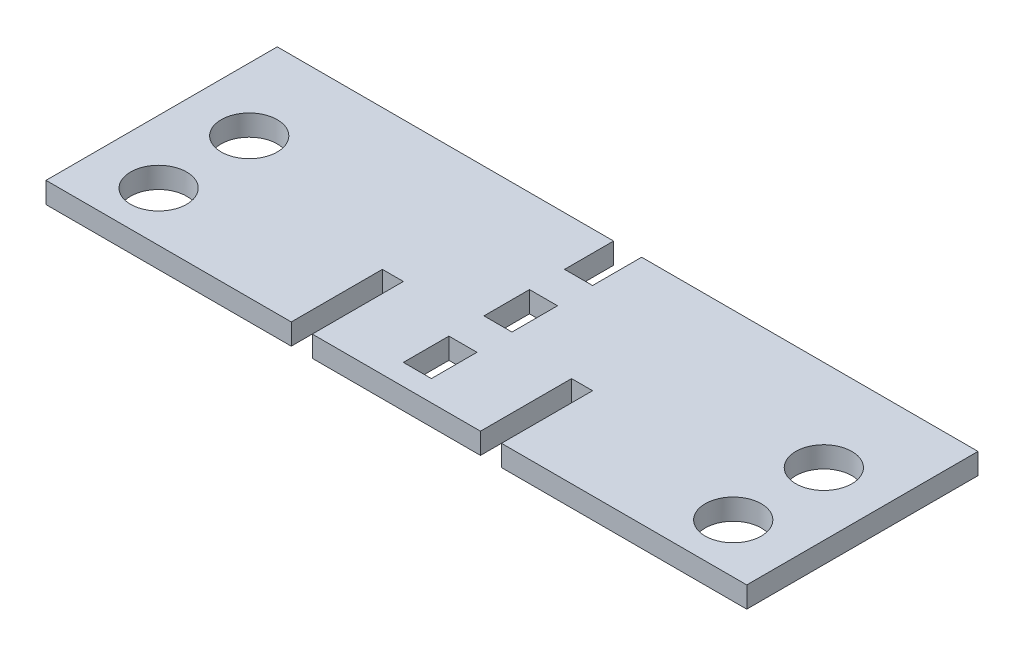
ISO-10303-21;
HEADER;
FILE_DESCRIPTION(('STEP AP214'),'2;1');
FILE_NAME('part.step','',(''),(''),'','','');
FILE_SCHEMA(('AUTOMOTIVE_DESIGN { 1 0 10303 214 1 1 1 1 }'));
ENDSEC;
DATA;
#1=APPLICATION_CONTEXT('core data for automotive mechanical design processes');
#2=APPLICATION_PROTOCOL_DEFINITION('international standard','automotive_design',2000,#1);
#3=PRODUCT_CONTEXT('',#1,'mechanical');
#4=PRODUCT('Part','Part','',(#3));
#5=PRODUCT_RELATED_PRODUCT_CATEGORY('part','',(#4));
#6=PRODUCT_DEFINITION_FORMATION('','',#4);
#7=PRODUCT_DEFINITION_CONTEXT('part definition',#1,'design');
#8=PRODUCT_DEFINITION('design','',#6,#7);
#9=PRODUCT_DEFINITION_SHAPE('','',#8);
#10=(LENGTH_UNIT() NAMED_UNIT(*) SI_UNIT(.MILLI.,.METRE.));
#11=(NAMED_UNIT(*) PLANE_ANGLE_UNIT() SI_UNIT($,.RADIAN.));
#12=(NAMED_UNIT(*) SI_UNIT($,.STERADIAN.) SOLID_ANGLE_UNIT());
#13=UNCERTAINTY_MEASURE_WITH_UNIT(LENGTH_MEASURE(1.E-05),#10,'distance_accuracy_value','');
#14=(GEOMETRIC_REPRESENTATION_CONTEXT(3) GLOBAL_UNCERTAINTY_ASSIGNED_CONTEXT((#13)) GLOBAL_UNIT_ASSIGNED_CONTEXT((#10,
#11,#12)) REPRESENTATION_CONTEXT('',''));
#15=CARTESIAN_POINT('',(0.,0.,0.));
#16=DIRECTION('',(0.,0.,1.));
#17=DIRECTION('',(1.,0.,0.));
#18=AXIS2_PLACEMENT_3D('',#15,#16,#17);
#19=CARTESIAN_POINT('',(-50.,3.,10.));
#20=DIRECTION('',(0.,0.,-1.));
#21=DIRECTION('',(-1.,0.,0.));
#22=AXIS2_PLACEMENT_3D('',#19,#20,#21);
#23=PLANE('',#22);
#24=DIRECTION('',(1.,0.,0.));
#25=VECTOR('',#24,1.);
#26=CARTESIAN_POINT('',(-50.,0.,10.));
#27=LINE('',#26,#25);
#28=CARTESIAN_POINT('',(12.,0.,10.));
#29=VERTEX_POINT('',#28);
#30=CARTESIAN_POINT('',(15.,0.,10.));
#31=VERTEX_POINT('',#30);
#32=EDGE_CURVE('E442',#29,#31,#27,.T.);
#33=ORIENTED_EDGE('',*,*,#32,.T.);
#34=DIRECTION('',(0.,1.,0.));
#35=VECTOR('',#34,1.);
#36=CARTESIAN_POINT('',(15.,-37.3363094051889,10.));
#37=LINE('',#36,#35);
#38=CARTESIAN_POINT('',(15.,3.,10.));
#39=VERTEX_POINT('',#38);
#40=EDGE_CURVE('E279',#31,#39,#37,.T.);
#41=ORIENTED_EDGE('',*,*,#40,.T.);
#42=DIRECTION('',(1.,0.,0.));
#43=VECTOR('',#42,1.);
#44=CARTESIAN_POINT('',(-50.,3.,10.));
#45=LINE('',#44,#43);
#46=CARTESIAN_POINT('',(12.,3.,10.));
#47=VERTEX_POINT('',#46);
#48=EDGE_CURVE('E419',#47,#39,#45,.T.);
#49=ORIENTED_EDGE('',*,*,#48,.F.);
#50=DIRECTION('',(0.,1.,0.));
#51=VECTOR('',#50,1.);
#52=CARTESIAN_POINT('',(12.,-27.2946881279124,10.));
#53=LINE('',#52,#51);
#54=EDGE_CURVE('E346',#29,#47,#53,.T.);
#55=ORIENTED_EDGE('',*,*,#54,.F.);
#56=EDGE_LOOP('',(#33,#41,#49,#55));
#57=FACE_BOUND('',#56,.T.);
#58=ADVANCED_FACE('F39',(#57),#23,.F.);
#59=CARTESIAN_POINT('',(0.,3.,0.));
#60=DIRECTION('',(0.,-1.,0.));
#61=DIRECTION('',(0.,0.,-1.));
#62=AXIS2_PLACEMENT_3D('',#59,#60,#61);
#63=PLANE('',#62);
#64=DIRECTION('',(1.,0.,0.));
#65=VECTOR('',#64,1.);
#66=CARTESIAN_POINT('',(-2.00000000000001,3.,8.50260308963582));
#67=LINE('',#66,#65);
#68=CARTESIAN_POINT('',(-2.00000000000001,3.,8.50260308963582));
#69=VERTEX_POINT('',#68);
#70=CARTESIAN_POINT('',(1.99999999999999,3.,8.50260308963582));
#71=VERTEX_POINT('',#70);
#72=EDGE_CURVE('E218',#69,#71,#67,.T.);
#73=ORIENTED_EDGE('',*,*,#72,.F.);
#74=DIRECTION('',(0.,0.,1.));
#75=VECTOR('',#74,1.);
#76=CARTESIAN_POINT('',(-2.00000000000001,3.,2.00260308963582));
#77=LINE('',#76,#75);
#78=CARTESIAN_POINT('',(-2.00000000000001,3.,2.00260308963582));
#79=VERTEX_POINT('',#78);
#80=EDGE_CURVE('E55',#79,#69,#77,.T.);
#81=ORIENTED_EDGE('',*,*,#80,.F.);
#82=DIRECTION('',(-1.,0.,0.));
#83=VECTOR('',#82,1.);
#84=CARTESIAN_POINT('',(-2.00000000000001,3.,2.00260308963582));
#85=LINE('',#84,#83);
#86=CARTESIAN_POINT('',(1.99999999999999,3.,2.00260308963582));
#87=VERTEX_POINT('',#86);
#88=EDGE_CURVE('E226',#87,#79,#85,.T.);
#89=ORIENTED_EDGE('',*,*,#88,.F.);
#90=DIRECTION('',(0.,0.,-1.));
#91=VECTOR('',#90,1.);
#92=CARTESIAN_POINT('',(1.99999999999999,3.,2.00260308963582));
#93=LINE('',#92,#91);
#94=EDGE_CURVE('E207',#71,#87,#93,.T.);
#95=ORIENTED_EDGE('',*,*,#94,.F.);
#96=EDGE_LOOP('',(#73,#81,#89,#95));
#97=FACE_BOUND('',#96,.T.);
#98=DIRECTION('',(1.,0.,0.));
#99=VECTOR('',#98,1.);
#100=CARTESIAN_POINT('',(-2.00000000000001,3.,20.0026030896358));
#101=LINE('',#100,#99);
#102=CARTESIAN_POINT('',(-2.00000000000001,3.,20.0026030896358));
#103=VERTEX_POINT('',#102);
#104=CARTESIAN_POINT('',(1.99999999999999,3.,20.0026030896358));
#105=VERTEX_POINT('',#104);
#106=EDGE_CURVE('E243',#103,#105,#101,.T.);
#107=ORIENTED_EDGE('',*,*,#106,.F.);
#108=DIRECTION('',(0.,0.,1.));
#109=VECTOR('',#108,1.);
#110=CARTESIAN_POINT('',(-2.00000000000001,3.,13.5026030896358));
#111=LINE('',#110,#109);
#112=CARTESIAN_POINT('',(-2.00000000000001,3.,13.5026030896358));
#113=VERTEX_POINT('',#112);
#114=EDGE_CURVE('E63',#113,#103,#111,.T.);
#115=ORIENTED_EDGE('',*,*,#114,.F.);
#116=DIRECTION('',(-1.,0.,0.));
#117=VECTOR('',#116,1.);
#118=CARTESIAN_POINT('',(-2.00000000000001,3.,13.5026030896358));
#119=LINE('',#118,#117);
#120=CARTESIAN_POINT('',(1.99999999999999,3.,13.5026030896358));
#121=VERTEX_POINT('',#120);
#122=EDGE_CURVE('E251',#121,#113,#119,.T.);
#123=ORIENTED_EDGE('',*,*,#122,.F.);
#124=DIRECTION('',(0.,0.,-1.));
#125=VECTOR('',#124,1.);
#126=CARTESIAN_POINT('',(1.99999999999999,3.,13.5026030896358));
#127=LINE('',#126,#125);
#128=EDGE_CURVE('E247',#105,#121,#127,.T.);
#129=ORIENTED_EDGE('',*,*,#128,.F.);
#130=EDGE_LOOP('',(#107,#115,#123,#129));
#131=FACE_BOUND('',#130,.T.);
#132=CARTESIAN_POINT('',(-41.,3.,15.9275305196327));
#133=DIRECTION('',(0.,1.,0.));
#134=DIRECTION('',(0.,0.,1.));
#135=AXIS2_PLACEMENT_3D('',#132,#133,#134);
#136=CIRCLE('',#135,4.00000000000001);
#137=CARTESIAN_POINT('',(-41.,3.,19.9275305196327));
#138=VERTEX_POINT('',#137);
#139=EDGE_CURVE('E267',#138,#138,#136,.T.);
#140=ORIENTED_EDGE('',*,*,#139,.F.);
#141=EDGE_LOOP('',(#140));
#142=FACE_BOUND('',#141,.T.);
#143=CARTESIAN_POINT('',(41.,3.,15.9275305196327));
#144=DIRECTION('',(0.,1.,0.));
#145=DIRECTION('',(0.,0.,1.));
#146=AXIS2_PLACEMENT_3D('',#143,#144,#145);
#147=CIRCLE('',#146,4.00000000000001);
#148=CARTESIAN_POINT('',(41.,3.,19.9275305196327));
#149=VERTEX_POINT('',#148);
#150=EDGE_CURVE('E236',#149,#149,#147,.T.);
#151=ORIENTED_EDGE('',*,*,#150,.F.);
#152=EDGE_LOOP('',(#151));
#153=FACE_BOUND('',#152,.T.);
#154=DIRECTION('',(0.,0.,1.));
#155=VECTOR('',#154,1.);
#156=CARTESIAN_POINT('',(1.99999999999999,3.,-10.));
#157=LINE('',#156,#155);
#158=CARTESIAN_POINT('',(1.99999999999999,3.,-10.));
#159=VERTEX_POINT('',#158);
#160=CARTESIAN_POINT('',(1.99999999999999,3.,-2.99739691036418));
#161=VERTEX_POINT('',#160);
#162=EDGE_CURVE('E407',#159,#161,#157,.T.);
#163=ORIENTED_EDGE('',*,*,#162,.T.);
#164=DIRECTION('',(1.,0.,0.));
#165=VECTOR('',#164,1.);
#166=CARTESIAN_POINT('',(-2.00000000000001,3.,-2.99739691036418));
#167=LINE('',#166,#165);
#168=CARTESIAN_POINT('',(-2.00000000000001,3.,-2.99739691036418));
#169=VERTEX_POINT('',#168);
#170=EDGE_CURVE('E378',#169,#161,#167,.T.);
#171=ORIENTED_EDGE('',*,*,#170,.F.);
#172=DIRECTION('',(0.,0.,-1.));
#173=VECTOR('',#172,1.);
#174=CARTESIAN_POINT('',(-2.00000000000001,3.,-10.));
#175=LINE('',#174,#173);
#176=CARTESIAN_POINT('',(-2.00000000000001,3.,-10.));
#177=VERTEX_POINT('',#176);
#178=EDGE_CURVE('E410',#169,#177,#175,.T.);
#179=ORIENTED_EDGE('',*,*,#178,.T.);
#180=DIRECTION('',(-1.,0.,0.));
#181=VECTOR('',#180,1.);
#182=CARTESIAN_POINT('',(-50.,3.,-10.));
#183=LINE('',#182,#181);
#184=CARTESIAN_POINT('',(-50.,3.,-10.));
#185=VERTEX_POINT('',#184);
#186=EDGE_CURVE('E413',#177,#185,#183,.T.);
#187=ORIENTED_EDGE('',*,*,#186,.T.);
#188=DIRECTION('',(0.,0.,1.));
#189=VECTOR('',#188,1.);
#190=CARTESIAN_POINT('',(-50.,3.,10.));
#191=LINE('',#190,#189);
#192=CARTESIAN_POINT('',(-50.,3.,23.));
#193=VERTEX_POINT('',#192);
#194=EDGE_CURVE('E416',#185,#193,#191,.T.);
#195=ORIENTED_EDGE('',*,*,#194,.T.);
#196=DIRECTION('',(1.,0.,0.));
#197=VECTOR('',#196,1.);
#198=CARTESIAN_POINT('',(-50.,3.,23.));
#199=LINE('',#198,#197);
#200=CARTESIAN_POINT('',(-15.,3.,23.));
#201=VERTEX_POINT('',#200);
#202=EDGE_CURVE('E298',#193,#201,#199,.T.);
#203=ORIENTED_EDGE('',*,*,#202,.T.);
#204=DIRECTION('',(0.,0.,-1.));
#205=VECTOR('',#204,1.);
#206=CARTESIAN_POINT('',(-15.,3.,10.));
#207=LINE('',#206,#205);
#208=CARTESIAN_POINT('',(-15.,3.,10.));
#209=VERTEX_POINT('',#208);
#210=EDGE_CURVE('E304',#201,#209,#207,.T.);
#211=ORIENTED_EDGE('',*,*,#210,.T.);
#212=CARTESIAN_POINT('',(-12.,3.,10.));
#213=VERTEX_POINT('',#212);
#214=EDGE_CURVE('E420',#209,#213,#45,.T.);
#215=ORIENTED_EDGE('',*,*,#214,.T.);
#216=DIRECTION('',(0.,0.,1.));
#217=VECTOR('',#216,1.);
#218=CARTESIAN_POINT('',(-12.,3.,23.));
#219=LINE('',#218,#217);
#220=CARTESIAN_POINT('',(-12.,3.,23.));
#221=VERTEX_POINT('',#220);
#222=EDGE_CURVE('E336',#213,#221,#219,.T.);
#223=ORIENTED_EDGE('',*,*,#222,.T.);
#224=DIRECTION('',(1.,0.,0.));
#225=VECTOR('',#224,1.);
#226=CARTESIAN_POINT('',(-12.,3.,23.));
#227=LINE('',#226,#225);
#228=CARTESIAN_POINT('',(12.,3.,23.));
#229=VERTEX_POINT('',#228);
#230=EDGE_CURVE('E331',#221,#229,#227,.T.);
#231=ORIENTED_EDGE('',*,*,#230,.T.);
#232=DIRECTION('',(0.,0.,-1.));
#233=VECTOR('',#232,1.);
#234=CARTESIAN_POINT('',(12.,3.,23.));
#235=LINE('',#234,#233);
#236=EDGE_CURVE('E330',#229,#47,#235,.T.);
#237=ORIENTED_EDGE('',*,*,#236,.T.);
#238=ORIENTED_EDGE('',*,*,#48,.T.);
#239=DIRECTION('',(0.,0.,1.));
#240=VECTOR('',#239,1.);
#241=CARTESIAN_POINT('',(15.,3.,10.));
#242=LINE('',#241,#240);
#243=CARTESIAN_POINT('',(15.,3.,23.));
#244=VERTEX_POINT('',#243);
#245=EDGE_CURVE('E280',#39,#244,#242,.T.);
#246=ORIENTED_EDGE('',*,*,#245,.T.);
#247=DIRECTION('',(1.,0.,0.));
#248=VECTOR('',#247,1.);
#249=CARTESIAN_POINT('',(50.,3.,23.));
#250=LINE('',#249,#248);
#251=CARTESIAN_POINT('',(50.,3.,23.));
#252=VERTEX_POINT('',#251);
#253=EDGE_CURVE('E275',#244,#252,#250,.T.);
#254=ORIENTED_EDGE('',*,*,#253,.T.);
#255=DIRECTION('',(0.,0.,-1.));
#256=VECTOR('',#255,1.);
#257=CARTESIAN_POINT('',(50.,3.,10.));
#258=LINE('',#257,#256);
#259=CARTESIAN_POINT('',(50.,3.,-10.));
#260=VERTEX_POINT('',#259);
#261=EDGE_CURVE('E399',#252,#260,#258,.T.);
#262=ORIENTED_EDGE('',*,*,#261,.T.);
#263=DIRECTION('',(-1.,0.,0.));
#264=VECTOR('',#263,1.);
#265=CARTESIAN_POINT('',(1.99999999999999,3.,-10.));
#266=LINE('',#265,#264);
#267=EDGE_CURVE('E403',#260,#159,#266,.T.);
#268=ORIENTED_EDGE('',*,*,#267,.T.);
#269=EDGE_LOOP('',(#163,#171,#179,#187,#195,#203,#211,#215,#223,#231,#237,#238,#246,#254,#262,#268));
#270=FACE_BOUND('',#269,.T.);
#271=CARTESIAN_POINT('',(-41.,3.,3.));
#272=DIRECTION('',(0.,1.,0.));
#273=DIRECTION('',(0.,0.,1.));
#274=AXIS2_PLACEMENT_3D('',#271,#272,#273);
#275=CIRCLE('',#274,4.00000000000001);
#276=CARTESIAN_POINT('',(-41.,3.,7.00000000000001));
#277=VERTEX_POINT('',#276);
#278=EDGE_CURVE('E391',#277,#277,#275,.T.);
#279=ORIENTED_EDGE('',*,*,#278,.F.);
#280=EDGE_LOOP('',(#279));
#281=FACE_BOUND('',#280,.T.);
#282=CARTESIAN_POINT('',(41.,3.,3.));
#283=DIRECTION('',(0.,1.,0.));
#284=DIRECTION('',(0.,0.,-1.));
#285=AXIS2_PLACEMENT_3D('',#282,#283,#284);
#286=CIRCLE('',#285,4.00000000000001);
#287=CARTESIAN_POINT('',(41.,3.,-1.));
#288=VERTEX_POINT('',#287);
#289=EDGE_CURVE('E383',#288,#288,#286,.T.);
#290=ORIENTED_EDGE('',*,*,#289,.F.);
#291=EDGE_LOOP('',(#290));
#292=FACE_BOUND('',#291,.T.);
#293=ADVANCED_FACE('F223',(#97,#131,#142,#153,#270,#281,#292),#63,.F.);
#294=CARTESIAN_POINT('',(0.,0.,0.));
#295=DIRECTION('',(0.,-1.,0.));
#296=DIRECTION('',(0.,0.,-1.));
#297=AXIS2_PLACEMENT_3D('',#294,#295,#296);
#298=PLANE('',#297);
#299=DIRECTION('',(0.,0.,-1.));
#300=VECTOR('',#299,1.);
#301=CARTESIAN_POINT('',(-2.00000000000001,0.,0.));
#302=LINE('',#301,#300);
#303=CARTESIAN_POINT('',(-2.00000000000001,0.,8.50260308963582));
#304=VERTEX_POINT('',#303);
#305=CARTESIAN_POINT('',(-2.00000000000001,0.,2.00260308963582));
#306=VERTEX_POINT('',#305);
#307=EDGE_CURVE('E11',#304,#306,#302,.T.);
#308=ORIENTED_EDGE('',*,*,#307,.F.);
#309=DIRECTION('',(-1.,0.,0.));
#310=VECTOR('',#309,1.);
#311=CARTESIAN_POINT('',(0.,0.,8.50260308963582));
#312=LINE('',#311,#310);
#313=CARTESIAN_POINT('',(1.99999999999999,0.,8.50260308963582));
#314=VERTEX_POINT('',#313);
#315=EDGE_CURVE('E479',#314,#304,#312,.T.);
#316=ORIENTED_EDGE('',*,*,#315,.F.);
#317=DIRECTION('',(0.,0.,1.));
#318=VECTOR('',#317,1.);
#319=CARTESIAN_POINT('',(1.99999999999999,0.,0.));
#320=LINE('',#319,#318);
#321=CARTESIAN_POINT('',(1.99999999999999,0.,2.00260308963582));
#322=VERTEX_POINT('',#321);
#323=EDGE_CURVE('E210',#322,#314,#320,.T.);
#324=ORIENTED_EDGE('',*,*,#323,.F.);
#325=DIRECTION('',(1.,0.,0.));
#326=VECTOR('',#325,1.);
#327=CARTESIAN_POINT('',(0.,0.,2.00260308963582));
#328=LINE('',#327,#326);
#329=EDGE_CURVE('E48',#306,#322,#328,.T.);
#330=ORIENTED_EDGE('',*,*,#329,.F.);
#331=EDGE_LOOP('',(#308,#316,#324,#330));
#332=FACE_BOUND('',#331,.T.);
#333=DIRECTION('',(0.,0.,-1.));
#334=VECTOR('',#333,1.);
#335=CARTESIAN_POINT('',(-2.00000000000001,0.,0.));
#336=LINE('',#335,#334);
#337=CARTESIAN_POINT('',(-2.00000000000001,0.,20.0026030896358));
#338=VERTEX_POINT('',#337);
#339=CARTESIAN_POINT('',(-2.00000000000001,0.,13.5026030896358));
#340=VERTEX_POINT('',#339);
#341=EDGE_CURVE('E476',#338,#340,#336,.T.);
#342=ORIENTED_EDGE('',*,*,#341,.F.);
#343=DIRECTION('',(-1.,0.,0.));
#344=VECTOR('',#343,1.);
#345=CARTESIAN_POINT('',(0.,0.,20.0026030896358));
#346=LINE('',#345,#344);
#347=CARTESIAN_POINT('',(1.99999999999999,0.,20.0026030896358));
#348=VERTEX_POINT('',#347);
#349=EDGE_CURVE('E460',#348,#338,#346,.T.);
#350=ORIENTED_EDGE('',*,*,#349,.F.);
#351=DIRECTION('',(0.,0.,1.));
#352=VECTOR('',#351,1.);
#353=CARTESIAN_POINT('',(1.99999999999999,0.,0.));
#354=LINE('',#353,#352);
#355=CARTESIAN_POINT('',(1.99999999999999,0.,13.5026030896358));
#356=VERTEX_POINT('',#355);
#357=EDGE_CURVE('E469',#356,#348,#354,.T.);
#358=ORIENTED_EDGE('',*,*,#357,.F.);
#359=DIRECTION('',(1.,0.,0.));
#360=VECTOR('',#359,1.);
#361=CARTESIAN_POINT('',(0.,0.,13.5026030896358));
#362=LINE('',#361,#360);
#363=EDGE_CURVE('E473',#340,#356,#362,.T.);
#364=ORIENTED_EDGE('',*,*,#363,.F.);
#365=EDGE_LOOP('',(#342,#350,#358,#364));
#366=FACE_BOUND('',#365,.T.);
#367=CARTESIAN_POINT('',(-41.,0.,15.9275305196327));
#368=DIRECTION('',(0.,-1.,0.));
#369=DIRECTION('',(0.,0.,-1.));
#370=AXIS2_PLACEMENT_3D('',#367,#368,#369);
#371=CIRCLE('',#370,4.00000000000001);
#372=CARTESIAN_POINT('',(-41.,0.,11.9275305196327));
#373=VERTEX_POINT('',#372);
#374=EDGE_CURVE('E284',#373,#373,#371,.T.);
#375=ORIENTED_EDGE('',*,*,#374,.F.);
#376=EDGE_LOOP('',(#375));
#377=FACE_BOUND('',#376,.T.);
#378=CARTESIAN_POINT('',(41.,0.,15.9275305196327));
#379=DIRECTION('',(0.,-1.,0.));
#380=DIRECTION('',(0.,0.,-1.));
#381=AXIS2_PLACEMENT_3D('',#378,#379,#380);
#382=CIRCLE('',#381,4.00000000000001);
#383=CARTESIAN_POINT('',(41.,0.,11.9275305196327));
#384=VERTEX_POINT('',#383);
#385=EDGE_CURVE('E271',#384,#384,#382,.T.);
#386=ORIENTED_EDGE('',*,*,#385,.F.);
#387=EDGE_LOOP('',(#386));
#388=FACE_BOUND('',#387,.T.);
#389=DIRECTION('',(-1.,0.,0.));
#390=VECTOR('',#389,1.);
#391=CARTESIAN_POINT('',(1.99999999999999,0.,-2.99739691036418));
#392=LINE('',#391,#390);
#393=CARTESIAN_POINT('',(1.99999999999999,0.,-2.99739691036418));
#394=VERTEX_POINT('',#393);
#395=CARTESIAN_POINT('',(-2.00000000000001,0.,-2.99739691036418));
#396=VERTEX_POINT('',#395);
#397=EDGE_CURVE('E370',#394,#396,#392,.T.);
#398=ORIENTED_EDGE('',*,*,#397,.F.);
#399=DIRECTION('',(0.,0.,1.));
#400=VECTOR('',#399,1.);
#401=CARTESIAN_POINT('',(1.99999999999999,0.,-10.));
#402=LINE('',#401,#400);
#403=CARTESIAN_POINT('',(1.99999999999999,0.,-10.));
#404=VERTEX_POINT('',#403);
#405=EDGE_CURVE('E430',#404,#394,#402,.T.);
#406=ORIENTED_EDGE('',*,*,#405,.F.);
#407=DIRECTION('',(-1.,0.,0.));
#408=VECTOR('',#407,1.);
#409=CARTESIAN_POINT('',(1.99999999999999,0.,-10.));
#410=LINE('',#409,#408);
#411=CARTESIAN_POINT('',(50.,0.,-10.));
#412=VERTEX_POINT('',#411);
#413=EDGE_CURVE('E427',#412,#404,#410,.T.);
#414=ORIENTED_EDGE('',*,*,#413,.F.);
#415=DIRECTION('',(0.,0.,-1.));
#416=VECTOR('',#415,1.);
#417=CARTESIAN_POINT('',(50.,0.,10.));
#418=LINE('',#417,#416);
#419=CARTESIAN_POINT('',(50.,0.,23.));
#420=VERTEX_POINT('',#419);
#421=EDGE_CURVE('E395',#420,#412,#418,.T.);
#422=ORIENTED_EDGE('',*,*,#421,.F.);
#423=DIRECTION('',(1.,0.,0.));
#424=VECTOR('',#423,1.);
#425=CARTESIAN_POINT('',(50.,0.,23.));
#426=LINE('',#425,#424);
#427=CARTESIAN_POINT('',(15.,0.,23.));
#428=VERTEX_POINT('',#427);
#429=EDGE_CURVE('E285',#428,#420,#426,.T.);
#430=ORIENTED_EDGE('',*,*,#429,.F.);
#431=DIRECTION('',(0.,0.,1.));
#432=VECTOR('',#431,1.);
#433=CARTESIAN_POINT('',(15.,0.,10.));
#434=LINE('',#433,#432);
#435=EDGE_CURVE('E291',#31,#428,#434,.T.);
#436=ORIENTED_EDGE('',*,*,#435,.F.);
#437=ORIENTED_EDGE('',*,*,#32,.F.);
#438=DIRECTION('',(0.,0.,-1.));
#439=VECTOR('',#438,1.);
#440=CARTESIAN_POINT('',(12.,0.,23.));
#441=LINE('',#440,#439);
#442=CARTESIAN_POINT('',(12.,0.,23.));
#443=VERTEX_POINT('',#442);
#444=EDGE_CURVE('E343',#443,#29,#441,.T.);
#445=ORIENTED_EDGE('',*,*,#444,.F.);
#446=DIRECTION('',(1.,0.,0.));
#447=VECTOR('',#446,1.);
#448=CARTESIAN_POINT('',(-12.,0.,23.));
#449=LINE('',#448,#447);
#450=CARTESIAN_POINT('',(-12.,0.,23.));
#451=VERTEX_POINT('',#450);
#452=EDGE_CURVE('E348',#451,#443,#449,.T.);
#453=ORIENTED_EDGE('',*,*,#452,.F.);
#454=DIRECTION('',(0.,0.,1.));
#455=VECTOR('',#454,1.);
#456=CARTESIAN_POINT('',(-12.,0.,23.));
#457=LINE('',#456,#455);
#458=CARTESIAN_POINT('',(-12.,0.,10.));
#459=VERTEX_POINT('',#458);
#460=EDGE_CURVE('E353',#459,#451,#457,.T.);
#461=ORIENTED_EDGE('',*,*,#460,.F.);
#462=CARTESIAN_POINT('',(-15.,0.,10.));
#463=VERTEX_POINT('',#462);
#464=EDGE_CURVE('E404',#463,#459,#27,.T.);
#465=ORIENTED_EDGE('',*,*,#464,.F.);
#466=DIRECTION('',(0.,0.,-1.));
#467=VECTOR('',#466,1.);
#468=CARTESIAN_POINT('',(-15.,0.,10.));
#469=LINE('',#468,#467);
#470=CARTESIAN_POINT('',(-15.,0.,23.));
#471=VERTEX_POINT('',#470);
#472=EDGE_CURVE('E316',#471,#463,#469,.T.);
#473=ORIENTED_EDGE('',*,*,#472,.F.);
#474=DIRECTION('',(1.,0.,0.));
#475=VECTOR('',#474,1.);
#476=CARTESIAN_POINT('',(-50.,0.,23.));
#477=LINE('',#476,#475);
#478=CARTESIAN_POINT('',(-50.,0.,23.));
#479=VERTEX_POINT('',#478);
#480=EDGE_CURVE('E308',#479,#471,#477,.T.);
#481=ORIENTED_EDGE('',*,*,#480,.F.);
#482=DIRECTION('',(0.,0.,1.));
#483=VECTOR('',#482,1.);
#484=CARTESIAN_POINT('',(-50.,0.,10.));
#485=LINE('',#484,#483);
#486=CARTESIAN_POINT('',(-50.,0.,-10.));
#487=VERTEX_POINT('',#486);
#488=EDGE_CURVE('E439',#487,#479,#485,.T.);
#489=ORIENTED_EDGE('',*,*,#488,.F.);
#490=DIRECTION('',(-1.,0.,0.));
#491=VECTOR('',#490,1.);
#492=CARTESIAN_POINT('',(-50.,0.,-10.));
#493=LINE('',#492,#491);
#494=CARTESIAN_POINT('',(-2.00000000000001,0.,-10.));
#495=VERTEX_POINT('',#494);
#496=EDGE_CURVE('E436',#495,#487,#493,.T.);
#497=ORIENTED_EDGE('',*,*,#496,.F.);
#498=DIRECTION('',(0.,0.,-1.));
#499=VECTOR('',#498,1.);
#500=CARTESIAN_POINT('',(-2.00000000000001,0.,-10.));
#501=LINE('',#500,#499);
#502=EDGE_CURVE('E433',#396,#495,#501,.T.);
#503=ORIENTED_EDGE('',*,*,#502,.F.);
#504=EDGE_LOOP('',(#398,#406,#414,#422,#430,#436,#437,#445,#453,#461,#465,#473,#481,#489,#497,#503));
#505=FACE_BOUND('',#504,.T.);
#506=CARTESIAN_POINT('',(-41.,0.,3.));
#507=DIRECTION('',(0.,1.,0.));
#508=DIRECTION('',(0.,0.,1.));
#509=AXIS2_PLACEMENT_3D('',#506,#507,#508);
#510=CIRCLE('',#509,4.00000000000001);
#511=CARTESIAN_POINT('',(-41.,0.,7.00000000000001));
#512=VERTEX_POINT('',#511);
#513=EDGE_CURVE('E387',#512,#512,#510,.T.);
#514=ORIENTED_EDGE('',*,*,#513,.T.);
#515=EDGE_LOOP('',(#514));
#516=FACE_BOUND('',#515,.T.);
#517=CARTESIAN_POINT('',(41.,0.,3.));
#518=DIRECTION('',(0.,1.,0.));
#519=DIRECTION('',(0.,0.,-1.));
#520=AXIS2_PLACEMENT_3D('',#517,#518,#519);
#521=CIRCLE('',#520,4.00000000000001);
#522=CARTESIAN_POINT('',(41.,0.,-1.));
#523=VERTEX_POINT('',#522);
#524=EDGE_CURVE('E382',#523,#523,#521,.T.);
#525=ORIENTED_EDGE('',*,*,#524,.T.);
#526=EDGE_LOOP('',(#525));
#527=FACE_BOUND('',#526,.T.);
#528=ADVANCED_FACE('F490',(#332,#366,#377,#388,#505,#516,#527),#298,.T.);
#529=CARTESIAN_POINT('',(50.,3.,10.));
#530=DIRECTION('',(-1.,0.,0.));
#531=DIRECTION('',(0.,0.,1.));
#532=AXIS2_PLACEMENT_3D('',#529,#530,#531);
#533=PLANE('',#532);
#534=ORIENTED_EDGE('',*,*,#421,.T.);
#535=DIRECTION('',(0.,-1.,0.));
#536=VECTOR('',#535,1.);
#537=CARTESIAN_POINT('',(50.,3.,-10.));
#538=LINE('',#537,#536);
#539=EDGE_CURVE('E456',#260,#412,#538,.T.);
#540=ORIENTED_EDGE('',*,*,#539,.F.);
#541=ORIENTED_EDGE('',*,*,#261,.F.);
#542=DIRECTION('',(0.,1.,0.));
#543=VECTOR('',#542,1.);
#544=CARTESIAN_POINT('',(50.,-37.3363094051889,23.));
#545=LINE('',#544,#543);
#546=EDGE_CURVE('E289',#420,#252,#545,.T.);
#547=ORIENTED_EDGE('',*,*,#546,.F.);
#548=EDGE_LOOP('',(#534,#540,#541,#547));
#549=FACE_BOUND('',#548,.T.);
#550=ADVANCED_FACE('F41',(#549),#533,.F.);
#551=CARTESIAN_POINT('',(1.99999999999999,3.,-10.));
#552=DIRECTION('',(0.,0.,1.));
#553=DIRECTION('',(1.,0.,0.));
#554=AXIS2_PLACEMENT_3D('',#551,#552,#553);
#555=PLANE('',#554);
#556=ORIENTED_EDGE('',*,*,#413,.T.);
#557=DIRECTION('',(0.,-1.,0.));
#558=VECTOR('',#557,1.);
#559=CARTESIAN_POINT('',(1.99999999999999,3.,-10.));
#560=LINE('',#559,#558);
#561=EDGE_CURVE('E452',#159,#404,#560,.T.);
#562=ORIENTED_EDGE('',*,*,#561,.F.);
#563=ORIENTED_EDGE('',*,*,#267,.F.);
#564=ORIENTED_EDGE('',*,*,#539,.T.);
#565=EDGE_LOOP('',(#556,#562,#563,#564));
#566=FACE_BOUND('',#565,.T.);
#567=ADVANCED_FACE('F583',(#566),#555,.F.);
#568=CARTESIAN_POINT('',(1.99999999999999,3.,-10.));
#569=DIRECTION('',(1.,0.,0.));
#570=DIRECTION('',(0.,0.,-1.));
#571=AXIS2_PLACEMENT_3D('',#568,#569,#570);
#572=PLANE('',#571);
#573=ORIENTED_EDGE('',*,*,#405,.T.);
#574=DIRECTION('',(0.,-1.,0.));
#575=VECTOR('',#574,1.);
#576=CARTESIAN_POINT('',(1.99999999999999,3.,-2.99739691036418));
#577=LINE('',#576,#575);
#578=EDGE_CURVE('E366',#161,#394,#577,.T.);
#579=ORIENTED_EDGE('',*,*,#578,.F.);
#580=ORIENTED_EDGE('',*,*,#162,.F.);
#581=ORIENTED_EDGE('',*,*,#561,.T.);
#582=EDGE_LOOP('',(#573,#579,#580,#581));
#583=FACE_BOUND('',#582,.T.);
#584=ADVANCED_FACE('F586',(#583),#572,.F.);
#585=CARTESIAN_POINT('',(-2.00000000000001,3.,-10.));
#586=DIRECTION('',(-1.,0.,0.));
#587=DIRECTION('',(0.,0.,1.));
#588=AXIS2_PLACEMENT_3D('',#585,#586,#587);
#589=PLANE('',#588);
#590=ORIENTED_EDGE('',*,*,#502,.T.);
#591=DIRECTION('',(0.,-1.,0.));
#592=VECTOR('',#591,1.);
#593=CARTESIAN_POINT('',(-2.00000000000001,3.,-10.));
#594=LINE('',#593,#592);
#595=EDGE_CURVE('E448',#177,#495,#594,.T.);
#596=ORIENTED_EDGE('',*,*,#595,.F.);
#597=ORIENTED_EDGE('',*,*,#178,.F.);
#598=DIRECTION('',(0.,1.,0.));
#599=VECTOR('',#598,1.);
#600=CARTESIAN_POINT('',(-2.00000000000001,0.,-2.99739691036418));
#601=LINE('',#600,#599);
#602=EDGE_CURVE('E374',#396,#169,#601,.T.);
#603=ORIENTED_EDGE('',*,*,#602,.F.);
#604=EDGE_LOOP('',(#590,#596,#597,#603));
#605=FACE_BOUND('',#604,.T.);
#606=ADVANCED_FACE('F594',(#605),#589,.F.);
#607=CARTESIAN_POINT('',(-50.,3.,-10.));
#608=DIRECTION('',(0.,0.,1.));
#609=DIRECTION('',(1.,0.,0.));
#610=AXIS2_PLACEMENT_3D('',#607,#608,#609);
#611=PLANE('',#610);
#612=ORIENTED_EDGE('',*,*,#496,.T.);
#613=DIRECTION('',(0.,-1.,0.));
#614=VECTOR('',#613,1.);
#615=CARTESIAN_POINT('',(-50.,3.,-10.));
#616=LINE('',#615,#614);
#617=EDGE_CURVE('E423',#185,#487,#616,.T.);
#618=ORIENTED_EDGE('',*,*,#617,.F.);
#619=ORIENTED_EDGE('',*,*,#186,.F.);
#620=ORIENTED_EDGE('',*,*,#595,.T.);
#621=EDGE_LOOP('',(#612,#618,#619,#620));
#622=FACE_BOUND('',#621,.T.);
#623=ADVANCED_FACE('F529',(#622),#611,.F.);
#624=CARTESIAN_POINT('',(-50.,3.,10.));
#625=DIRECTION('',(1.,0.,0.));
#626=DIRECTION('',(0.,0.,-1.));
#627=AXIS2_PLACEMENT_3D('',#624,#625,#626);
#628=PLANE('',#627);
#629=ORIENTED_EDGE('',*,*,#488,.T.);
#630=DIRECTION('',(0.,1.,0.));
#631=VECTOR('',#630,1.);
#632=CARTESIAN_POINT('',(-50.,-37.3363094051889,23.));
#633=LINE('',#632,#631);
#634=EDGE_CURVE('E324',#479,#193,#633,.T.);
#635=ORIENTED_EDGE('',*,*,#634,.T.);
#636=ORIENTED_EDGE('',*,*,#194,.F.);
#637=ORIENTED_EDGE('',*,*,#617,.T.);
#638=EDGE_LOOP('',(#629,#635,#636,#637));
#639=FACE_BOUND('',#638,.T.);
#640=ADVANCED_FACE('F520',(#639),#628,.F.);
#641=ORIENTED_EDGE('',*,*,#214,.F.);
#642=DIRECTION('',(0.,1.,0.));
#643=VECTOR('',#642,1.);
#644=CARTESIAN_POINT('',(-15.,-37.3363094051889,10.));
#645=LINE('',#644,#643);
#646=EDGE_CURVE('E320',#463,#209,#645,.T.);
#647=ORIENTED_EDGE('',*,*,#646,.F.);
#648=ORIENTED_EDGE('',*,*,#464,.T.);
#649=DIRECTION('',(0.,1.,0.));
#650=VECTOR('',#649,1.);
#651=CARTESIAN_POINT('',(-12.,-27.2946881279124,10.));
#652=LINE('',#651,#650);
#653=EDGE_CURVE('E335',#459,#213,#652,.T.);
#654=ORIENTED_EDGE('',*,*,#653,.T.);
#655=EDGE_LOOP('',(#641,#647,#648,#654));
#656=FACE_BOUND('',#655,.T.);
#657=ADVANCED_FACE('F510',(#656),#23,.F.);
#658=CARTESIAN_POINT('',(-41.,3.,3.));
#659=DIRECTION('',(0.,-1.,0.));
#660=DIRECTION('',(0.,0.,-1.));
#661=AXIS2_PLACEMENT_3D('',#658,#659,#660);
#662=CYLINDRICAL_SURFACE('',#661,4.00000000000001);
#663=ORIENTED_EDGE('',*,*,#278,.T.);
#664=EDGE_LOOP('',(#663));
#665=FACE_BOUND('',#664,.T.);
#666=ORIENTED_EDGE('',*,*,#513,.F.);
#667=EDGE_LOOP('',(#666));
#668=FACE_BOUND('',#667,.T.);
#669=ADVANCED_FACE('F519',(#665,#668),#662,.F.);
#670=CARTESIAN_POINT('',(41.,3.,3.));
#671=DIRECTION('',(0.,-1.,0.));
#672=DIRECTION('',(0.,0.,-1.));
#673=AXIS2_PLACEMENT_3D('',#670,#671,#672);
#674=CYLINDRICAL_SURFACE('',#673,4.00000000000001);
#675=ORIENTED_EDGE('',*,*,#289,.T.);
#676=EDGE_LOOP('',(#675));
#677=FACE_BOUND('',#676,.T.);
#678=ORIENTED_EDGE('',*,*,#524,.F.);
#679=EDGE_LOOP('',(#678));
#680=FACE_BOUND('',#679,.T.);
#681=ADVANCED_FACE('F526',(#677,#680),#674,.F.);
#682=CARTESIAN_POINT('',(0.,0.,-2.99739691036418));
#683=DIRECTION('',(0.,0.,-1.));
#684=DIRECTION('',(-1.,0.,0.));
#685=AXIS2_PLACEMENT_3D('',#682,#683,#684);
#686=PLANE('',#685);
#687=ORIENTED_EDGE('',*,*,#578,.T.);
#688=ORIENTED_EDGE('',*,*,#397,.T.);
#689=ORIENTED_EDGE('',*,*,#602,.T.);
#690=ORIENTED_EDGE('',*,*,#170,.T.);
#691=EDGE_LOOP('',(#687,#688,#689,#690));
#692=FACE_BOUND('',#691,.T.);
#693=ADVANCED_FACE('F588',(#692),#686,.T.);
#694=CARTESIAN_POINT('',(-12.,-27.2946881279124,23.));
#695=DIRECTION('',(-1.,0.,0.));
#696=DIRECTION('',(0.,0.,1.));
#697=AXIS2_PLACEMENT_3D('',#694,#695,#696);
#698=PLANE('',#697);
#699=ORIENTED_EDGE('',*,*,#653,.F.);
#700=ORIENTED_EDGE('',*,*,#460,.T.);
#701=DIRECTION('',(0.,1.,0.));
#702=VECTOR('',#701,1.);
#703=CARTESIAN_POINT('',(-12.,-27.2946881279124,23.));
#704=LINE('',#703,#702);
#705=EDGE_CURVE('E352',#451,#221,#704,.T.);
#706=ORIENTED_EDGE('',*,*,#705,.T.);
#707=ORIENTED_EDGE('',*,*,#222,.F.);
#708=EDGE_LOOP('',(#699,#700,#706,#707));
#709=FACE_BOUND('',#708,.T.);
#710=ADVANCED_FACE('F554',(#709),#698,.T.);
#711=CARTESIAN_POINT('',(-12.,-27.2946881279124,23.));
#712=DIRECTION('',(0.,0.,1.));
#713=DIRECTION('',(1.,0.,0.));
#714=AXIS2_PLACEMENT_3D('',#711,#712,#713);
#715=PLANE('',#714);
#716=ORIENTED_EDGE('',*,*,#705,.F.);
#717=ORIENTED_EDGE('',*,*,#452,.T.);
#718=DIRECTION('',(0.,1.,0.));
#719=VECTOR('',#718,1.);
#720=CARTESIAN_POINT('',(12.,-27.2946881279124,23.));
#721=LINE('',#720,#719);
#722=EDGE_CURVE('E347',#443,#229,#721,.T.);
#723=ORIENTED_EDGE('',*,*,#722,.T.);
#724=ORIENTED_EDGE('',*,*,#230,.F.);
#725=EDGE_LOOP('',(#716,#717,#723,#724));
#726=FACE_BOUND('',#725,.T.);
#727=ADVANCED_FACE('F557',(#726),#715,.T.);
#728=CARTESIAN_POINT('',(12.,-27.2946881279124,23.));
#729=DIRECTION('',(1.,0.,0.));
#730=DIRECTION('',(0.,0.,-1.));
#731=AXIS2_PLACEMENT_3D('',#728,#729,#730);
#732=PLANE('',#731);
#733=ORIENTED_EDGE('',*,*,#722,.F.);
#734=ORIENTED_EDGE('',*,*,#444,.T.);
#735=ORIENTED_EDGE('',*,*,#54,.T.);
#736=ORIENTED_EDGE('',*,*,#236,.F.);
#737=EDGE_LOOP('',(#733,#734,#735,#736));
#738=FACE_BOUND('',#737,.T.);
#739=ADVANCED_FACE('F561',(#738),#732,.T.);
#740=CARTESIAN_POINT('',(-50.,-37.3363094051889,23.));
#741=DIRECTION('',(0.,0.,1.));
#742=DIRECTION('',(1.,0.,0.));
#743=AXIS2_PLACEMENT_3D('',#740,#741,#742);
#744=PLANE('',#743);
#745=ORIENTED_EDGE('',*,*,#634,.F.);
#746=ORIENTED_EDGE('',*,*,#480,.T.);
#747=DIRECTION('',(0.,1.,0.));
#748=VECTOR('',#747,1.);
#749=CARTESIAN_POINT('',(-15.,-37.3363094051889,23.));
#750=LINE('',#749,#748);
#751=EDGE_CURVE('E315',#471,#201,#750,.T.);
#752=ORIENTED_EDGE('',*,*,#751,.T.);
#753=ORIENTED_EDGE('',*,*,#202,.F.);
#754=EDGE_LOOP('',(#745,#746,#752,#753));
#755=FACE_BOUND('',#754,.T.);
#756=ADVANCED_FACE('F544',(#755),#744,.T.);
#757=CARTESIAN_POINT('',(-15.,-37.3363094051889,10.));
#758=DIRECTION('',(1.,0.,0.));
#759=DIRECTION('',(0.,0.,-1.));
#760=AXIS2_PLACEMENT_3D('',#757,#758,#759);
#761=PLANE('',#760);
#762=ORIENTED_EDGE('',*,*,#751,.F.);
#763=ORIENTED_EDGE('',*,*,#472,.T.);
#764=ORIENTED_EDGE('',*,*,#646,.T.);
#765=ORIENTED_EDGE('',*,*,#210,.F.);
#766=EDGE_LOOP('',(#762,#763,#764,#765));
#767=FACE_BOUND('',#766,.T.);
#768=ADVANCED_FACE('F538',(#767),#761,.T.);
#769=CARTESIAN_POINT('',(15.,-37.3363094051889,10.));
#770=DIRECTION('',(-1.,0.,0.));
#771=DIRECTION('',(0.,0.,1.));
#772=AXIS2_PLACEMENT_3D('',#769,#770,#771);
#773=PLANE('',#772);
#774=ORIENTED_EDGE('',*,*,#40,.F.);
#775=ORIENTED_EDGE('',*,*,#435,.T.);
#776=DIRECTION('',(0.,1.,0.));
#777=VECTOR('',#776,1.);
#778=CARTESIAN_POINT('',(15.,-37.3363094051889,23.));
#779=LINE('',#778,#777);
#780=EDGE_CURVE('E290',#428,#244,#779,.T.);
#781=ORIENTED_EDGE('',*,*,#780,.T.);
#782=ORIENTED_EDGE('',*,*,#245,.F.);
#783=EDGE_LOOP('',(#774,#775,#781,#782));
#784=FACE_BOUND('',#783,.T.);
#785=ADVANCED_FACE('F571',(#784),#773,.T.);
#786=CARTESIAN_POINT('',(50.,-37.3363094051889,23.));
#787=DIRECTION('',(0.,0.,1.));
#788=DIRECTION('',(1.,0.,0.));
#789=AXIS2_PLACEMENT_3D('',#786,#787,#788);
#790=PLANE('',#789);
#791=ORIENTED_EDGE('',*,*,#780,.F.);
#792=ORIENTED_EDGE('',*,*,#429,.T.);
#793=ORIENTED_EDGE('',*,*,#546,.T.);
#794=ORIENTED_EDGE('',*,*,#253,.F.);
#795=EDGE_LOOP('',(#791,#792,#793,#794));
#796=FACE_BOUND('',#795,.T.);
#797=ADVANCED_FACE('F574',(#796),#790,.T.);
#798=CARTESIAN_POINT('',(41.,-22.,15.9275305196327));
#799=DIRECTION('',(0.,1.,0.));
#800=DIRECTION('',(0.,0.,1.));
#801=AXIS2_PLACEMENT_3D('',#798,#799,#800);
#802=CYLINDRICAL_SURFACE('',#801,4.00000000000001);
#803=ORIENTED_EDGE('',*,*,#385,.T.);
#804=EDGE_LOOP('',(#803));
#805=FACE_BOUND('',#804,.T.);
#806=ORIENTED_EDGE('',*,*,#150,.T.);
#807=EDGE_LOOP('',(#806));
#808=FACE_BOUND('',#807,.T.);
#809=ADVANCED_FACE('F633',(#805,#808),#802,.F.);
#810=CARTESIAN_POINT('',(-41.,-22.,15.9275305196327));
#811=DIRECTION('',(0.,1.,0.));
#812=DIRECTION('',(0.,0.,1.));
#813=AXIS2_PLACEMENT_3D('',#810,#811,#812);
#814=CYLINDRICAL_SURFACE('',#813,4.00000000000001);
#815=ORIENTED_EDGE('',*,*,#374,.T.);
#816=EDGE_LOOP('',(#815));
#817=FACE_BOUND('',#816,.T.);
#818=ORIENTED_EDGE('',*,*,#139,.T.);
#819=EDGE_LOOP('',(#818));
#820=FACE_BOUND('',#819,.T.);
#821=ADVANCED_FACE('F636',(#817,#820),#814,.F.);
#822=CARTESIAN_POINT('',(-2.00000000000001,-22.,13.5026030896358));
#823=DIRECTION('',(-1.,0.,0.));
#824=DIRECTION('',(0.,0.,1.));
#825=AXIS2_PLACEMENT_3D('',#822,#823,#824);
#826=PLANE('',#825);
#827=ORIENTED_EDGE('',*,*,#341,.T.);
#828=DIRECTION('',(0.,1.,0.));
#829=VECTOR('',#828,1.);
#830=CARTESIAN_POINT('',(-2.00000000000001,-22.,13.5026030896358));
#831=LINE('',#830,#829);
#832=EDGE_CURVE('E256',#340,#113,#831,.T.);
#833=ORIENTED_EDGE('',*,*,#832,.T.);
#834=ORIENTED_EDGE('',*,*,#114,.T.);
#835=DIRECTION('',(0.,1.,0.));
#836=VECTOR('',#835,1.);
#837=CARTESIAN_POINT('',(-2.00000000000001,-22.,20.0026030896358));
#838=LINE('',#837,#836);
#839=EDGE_CURVE('E255',#338,#103,#838,.T.);
#840=ORIENTED_EDGE('',*,*,#839,.F.);
#841=EDGE_LOOP('',(#827,#833,#834,#840));
#842=FACE_BOUND('',#841,.T.);
#843=ADVANCED_FACE('F640',(#842),#826,.F.);
#844=CARTESIAN_POINT('',(-2.00000000000001,-22.,13.5026030896358));
#845=DIRECTION('',(0.,0.,-1.));
#846=DIRECTION('',(-1.,0.,0.));
#847=AXIS2_PLACEMENT_3D('',#844,#845,#846);
#848=PLANE('',#847);
#849=ORIENTED_EDGE('',*,*,#363,.T.);
#850=DIRECTION('',(0.,1.,0.));
#851=VECTOR('',#850,1.);
#852=CARTESIAN_POINT('',(1.99999999999999,-22.,13.5026030896358));
#853=LINE('',#852,#851);
#854=EDGE_CURVE('E259',#356,#121,#853,.T.);
#855=ORIENTED_EDGE('',*,*,#854,.T.);
#856=ORIENTED_EDGE('',*,*,#122,.T.);
#857=ORIENTED_EDGE('',*,*,#832,.F.);
#858=EDGE_LOOP('',(#849,#855,#856,#857));
#859=FACE_BOUND('',#858,.T.);
#860=ADVANCED_FACE('F643',(#859),#848,.F.);
#861=CARTESIAN_POINT('',(1.99999999999999,-22.,13.5026030896358));
#862=DIRECTION('',(1.,0.,0.));
#863=DIRECTION('',(0.,0.,-1.));
#864=AXIS2_PLACEMENT_3D('',#861,#862,#863);
#865=PLANE('',#864);
#866=ORIENTED_EDGE('',*,*,#357,.T.);
#867=DIRECTION('',(0.,1.,0.));
#868=VECTOR('',#867,1.);
#869=CARTESIAN_POINT('',(1.99999999999999,-22.,20.0026030896358));
#870=LINE('',#869,#868);
#871=EDGE_CURVE('E262',#348,#105,#870,.T.);
#872=ORIENTED_EDGE('',*,*,#871,.T.);
#873=ORIENTED_EDGE('',*,*,#128,.T.);
#874=ORIENTED_EDGE('',*,*,#854,.F.);
#875=EDGE_LOOP('',(#866,#872,#873,#874));
#876=FACE_BOUND('',#875,.T.);
#877=ADVANCED_FACE('F502',(#876),#865,.F.);
#878=CARTESIAN_POINT('',(-2.00000000000001,-22.,20.0026030896358));
#879=DIRECTION('',(0.,0.,1.));
#880=DIRECTION('',(1.,0.,0.));
#881=AXIS2_PLACEMENT_3D('',#878,#879,#880);
#882=PLANE('',#881);
#883=ORIENTED_EDGE('',*,*,#349,.T.);
#884=ORIENTED_EDGE('',*,*,#839,.T.);
#885=ORIENTED_EDGE('',*,*,#106,.T.);
#886=ORIENTED_EDGE('',*,*,#871,.F.);
#887=EDGE_LOOP('',(#883,#884,#885,#886));
#888=FACE_BOUND('',#887,.T.);
#889=ADVANCED_FACE('F495',(#888),#882,.F.);
#890=CARTESIAN_POINT('',(-2.00000000000001,-22.,2.00260308963582));
#891=DIRECTION('',(-1.,0.,0.));
#892=DIRECTION('',(0.,0.,1.));
#893=AXIS2_PLACEMENT_3D('',#890,#891,#892);
#894=PLANE('',#893);
#895=ORIENTED_EDGE('',*,*,#307,.T.);
#896=DIRECTION('',(0.,1.,0.));
#897=VECTOR('',#896,1.);
#898=CARTESIAN_POINT('',(-2.00000000000001,-22.,2.00260308963582));
#899=LINE('',#898,#897);
#900=EDGE_CURVE('E233',#306,#79,#899,.T.);
#901=ORIENTED_EDGE('',*,*,#900,.T.);
#902=ORIENTED_EDGE('',*,*,#80,.T.);
#903=DIRECTION('',(0.,1.,0.));
#904=VECTOR('',#903,1.);
#905=CARTESIAN_POINT('',(-2.00000000000001,-22.,8.50260308963582));
#906=LINE('',#905,#904);
#907=EDGE_CURVE('E215',#304,#69,#906,.T.);
#908=ORIENTED_EDGE('',*,*,#907,.F.);
#909=EDGE_LOOP('',(#895,#901,#902,#908));
#910=FACE_BOUND('',#909,.T.);
#911=ADVANCED_FACE('F492',(#910),#894,.F.);
#912=CARTESIAN_POINT('',(-2.00000000000001,-22.,2.00260308963582));
#913=DIRECTION('',(0.,0.,-1.));
#914=DIRECTION('',(-1.,0.,0.));
#915=AXIS2_PLACEMENT_3D('',#912,#913,#914);
#916=PLANE('',#915);
#917=ORIENTED_EDGE('',*,*,#329,.T.);
#918=DIRECTION('',(0.,1.,0.));
#919=VECTOR('',#918,1.);
#920=CARTESIAN_POINT('',(1.99999999999999,-22.,2.00260308963582));
#921=LINE('',#920,#919);
#922=EDGE_CURVE('E214',#322,#87,#921,.T.);
#923=ORIENTED_EDGE('',*,*,#922,.T.);
#924=ORIENTED_EDGE('',*,*,#88,.T.);
#925=ORIENTED_EDGE('',*,*,#900,.F.);
#926=EDGE_LOOP('',(#917,#923,#924,#925));
#927=FACE_BOUND('',#926,.T.);
#928=ADVANCED_FACE('F487',(#927),#916,.F.);
#929=CARTESIAN_POINT('',(1.99999999999999,-22.,2.00260308963582));
#930=DIRECTION('',(1.,0.,0.));
#931=DIRECTION('',(0.,0.,-1.));
#932=AXIS2_PLACEMENT_3D('',#929,#930,#931);
#933=PLANE('',#932);
#934=ORIENTED_EDGE('',*,*,#323,.T.);
#935=DIRECTION('',(0.,1.,0.));
#936=VECTOR('',#935,1.);
#937=CARTESIAN_POINT('',(1.99999999999999,-22.,8.50260308963582));
#938=LINE('',#937,#936);
#939=EDGE_CURVE('E202',#314,#71,#938,.T.);
#940=ORIENTED_EDGE('',*,*,#939,.T.);
#941=ORIENTED_EDGE('',*,*,#94,.T.);
#942=ORIENTED_EDGE('',*,*,#922,.F.);
#943=EDGE_LOOP('',(#934,#940,#941,#942));
#944=FACE_BOUND('',#943,.T.);
#945=ADVANCED_FACE('F204',(#944),#933,.F.);
#946=CARTESIAN_POINT('',(-2.00000000000001,-22.,8.50260308963582));
#947=DIRECTION('',(0.,0.,1.));
#948=DIRECTION('',(1.,0.,0.));
#949=AXIS2_PLACEMENT_3D('',#946,#947,#948);
#950=PLANE('',#949);
#951=ORIENTED_EDGE('',*,*,#315,.T.);
#952=ORIENTED_EDGE('',*,*,#907,.T.);
#953=ORIENTED_EDGE('',*,*,#72,.T.);
#954=ORIENTED_EDGE('',*,*,#939,.F.);
#955=EDGE_LOOP('',(#951,#952,#953,#954));
#956=FACE_BOUND('',#955,.T.);
#957=ADVANCED_FACE('F219',(#956),#950,.F.);
#958=CLOSED_SHELL('',(#58,#293,#528,#550,#567,#584,#606,#623,#640,#657,#669,#681,#693,#710,#727,
#739,#756,#768,#785,#797,#809,#821,#843,#860,#877,#889,#911,#928,#945,#957));
#959=MANIFOLD_SOLID_BREP('B2',#958);
#960=ADVANCED_BREP_SHAPE_REPRESENTATION('',(#18,#959),#14);
#961=SHAPE_DEFINITION_REPRESENTATION(#9,#960);
ENDSEC;
END-ISO-10303-21;
